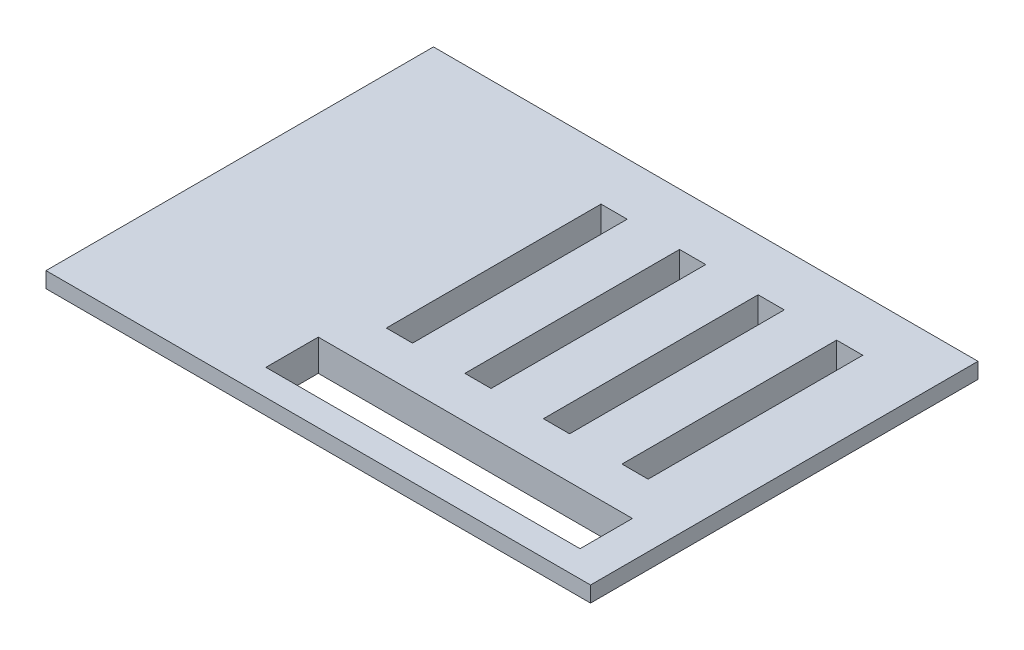
ISO-10303-21;
HEADER;
FILE_DESCRIPTION(('STEP AP214'),'2;1');
FILE_NAME('part.step','',(''),(''),'','','');
FILE_SCHEMA(('AUTOMOTIVE_DESIGN { 1 0 10303 214 1 1 1 1 }'));
ENDSEC;
DATA;
#1=APPLICATION_CONTEXT('core data for automotive mechanical design processes');
#2=APPLICATION_PROTOCOL_DEFINITION('international standard','automotive_design',2000,#1);
#3=PRODUCT_CONTEXT('',#1,'mechanical');
#4=PRODUCT('Part','Part','',(#3));
#5=PRODUCT_RELATED_PRODUCT_CATEGORY('part','',(#4));
#6=PRODUCT_DEFINITION_FORMATION('','',#4);
#7=PRODUCT_DEFINITION_CONTEXT('part definition',#1,'design');
#8=PRODUCT_DEFINITION('design','',#6,#7);
#9=PRODUCT_DEFINITION_SHAPE('','',#8);
#10=(LENGTH_UNIT() NAMED_UNIT(*) SI_UNIT(.MILLI.,.METRE.));
#11=(NAMED_UNIT(*) PLANE_ANGLE_UNIT() SI_UNIT($,.RADIAN.));
#12=(NAMED_UNIT(*) SI_UNIT($,.STERADIAN.) SOLID_ANGLE_UNIT());
#13=UNCERTAINTY_MEASURE_WITH_UNIT(LENGTH_MEASURE(1.E-05),#10,'distance_accuracy_value','');
#14=(GEOMETRIC_REPRESENTATION_CONTEXT(3) GLOBAL_UNCERTAINTY_ASSIGNED_CONTEXT((#13)) GLOBAL_UNIT_ASSIGNED_CONTEXT((#10,
#11,#12)) REPRESENTATION_CONTEXT('',''));
#15=CARTESIAN_POINT('',(0.,0.,0.));
#16=DIRECTION('',(0.,0.,1.));
#17=DIRECTION('',(1.,0.,0.));
#18=AXIS2_PLACEMENT_3D('',#15,#16,#17);
#19=CARTESIAN_POINT('',(0.,-3.,0.));
#20=DIRECTION('',(0.,1.,0.));
#21=DIRECTION('',(0.,0.,1.));
#22=AXIS2_PLACEMENT_3D('',#19,#20,#21);
#23=PLANE('',#22);
#24=DIRECTION('',(1.,0.,0.));
#25=VECTOR('',#24,1.);
#26=CARTESIAN_POINT('',(65.,-3.,-59.));
#27=LINE('',#26,#25);
#28=CARTESIAN_POINT('',(65.,-3.,-59.));
#29=VERTEX_POINT('',#28);
#30=CARTESIAN_POINT('',(70.,-3.,-59.));
#31=VERTEX_POINT('',#30);
#32=EDGE_CURVE('E279',#29,#31,#27,.T.);
#33=ORIENTED_EDGE('',*,*,#32,.F.);
#34=DIRECTION('',(0.,0.,1.));
#35=VECTOR('',#34,1.);
#36=CARTESIAN_POINT('',(65.,-3.,-59.));
#37=LINE('',#36,#35);
#38=CARTESIAN_POINT('',(65.,-3.,-18.));
#39=VERTEX_POINT('',#38);
#40=EDGE_CURVE('E274',#29,#39,#37,.T.);
#41=ORIENTED_EDGE('',*,*,#40,.T.);
#42=DIRECTION('',(1.,0.,0.));
#43=VECTOR('',#42,1.);
#44=CARTESIAN_POINT('',(65.,-3.,-18.));
#45=LINE('',#44,#43);
#46=CARTESIAN_POINT('',(70.,-3.,-18.));
#47=VERTEX_POINT('',#46);
#48=EDGE_CURVE('E61',#39,#47,#45,.T.);
#49=ORIENTED_EDGE('',*,*,#48,.T.);
#50=DIRECTION('',(0.,0.,1.));
#51=VECTOR('',#50,1.);
#52=CARTESIAN_POINT('',(70.,-3.,-59.));
#53=LINE('',#52,#51);
#54=EDGE_CURVE('E292',#31,#47,#53,.T.);
#55=ORIENTED_EDGE('',*,*,#54,.F.);
#56=EDGE_LOOP('',(#33,#41,#49,#55));
#57=FACE_BOUND('',#56,.T.);
#58=DIRECTION('',(0.,0.,1.));
#59=VECTOR('',#58,1.);
#60=CARTESIAN_POINT('',(55.,-3.,0.));
#61=LINE('',#60,#59);
#62=CARTESIAN_POINT('',(55.,-3.,-59.));
#63=VERTEX_POINT('',#62);
#64=CARTESIAN_POINT('',(55.,-3.,-18.));
#65=VERTEX_POINT('',#64);
#66=EDGE_CURVE('E310',#63,#65,#61,.T.);
#67=ORIENTED_EDGE('',*,*,#66,.F.);
#68=DIRECTION('',(1.,0.,0.));
#69=VECTOR('',#68,1.);
#70=CARTESIAN_POINT('',(0.,-3.,-59.));
#71=LINE('',#70,#69);
#72=CARTESIAN_POINT('',(50.,-3.,-59.));
#73=VERTEX_POINT('',#72);
#74=EDGE_CURVE('E323',#73,#63,#71,.T.);
#75=ORIENTED_EDGE('',*,*,#74,.F.);
#76=DIRECTION('',(0.,0.,1.));
#77=VECTOR('',#76,1.);
#78=CARTESIAN_POINT('',(50.,-3.,0.));
#79=LINE('',#78,#77);
#80=CARTESIAN_POINT('',(50.,-3.,-18.));
#81=VERTEX_POINT('',#80);
#82=EDGE_CURVE('E320',#73,#81,#79,.T.);
#83=ORIENTED_EDGE('',*,*,#82,.T.);
#84=DIRECTION('',(1.,0.,0.));
#85=VECTOR('',#84,1.);
#86=CARTESIAN_POINT('',(0.,-3.,-18.));
#87=LINE('',#86,#85);
#88=EDGE_CURVE('E298',#81,#65,#87,.T.);
#89=ORIENTED_EDGE('',*,*,#88,.T.);
#90=EDGE_LOOP('',(#67,#75,#83,#89));
#91=FACE_BOUND('',#90,.T.);
#92=DIRECTION('',(-1.,0.,0.));
#93=VECTOR('',#92,1.);
#94=CARTESIAN_POINT('',(0.,-3.,-10.));
#95=LINE('',#94,#93);
#96=CARTESIAN_POINT('',(90.,-3.,-10.));
#97=VERTEX_POINT('',#96);
#98=CARTESIAN_POINT('',(30.,-3.,-10.));
#99=VERTEX_POINT('',#98);
#100=EDGE_CURVE('E370',#97,#99,#95,.T.);
#101=ORIENTED_EDGE('',*,*,#100,.T.);
#102=DIRECTION('',(0.,0.,1.));
#103=VECTOR('',#102,1.);
#104=CARTESIAN_POINT('',(30.,-3.,0.));
#105=LINE('',#104,#103);
#106=CARTESIAN_POINT('',(30.,-3.,0.));
#107=VERTEX_POINT('',#106);
#108=EDGE_CURVE('E384',#99,#107,#105,.T.);
#109=ORIENTED_EDGE('',*,*,#108,.T.);
#110=DIRECTION('',(1.,0.,0.));
#111=VECTOR('',#110,1.);
#112=CARTESIAN_POINT('',(0.,-3.,0.));
#113=LINE('',#112,#111);
#114=CARTESIAN_POINT('',(0.,-3.,0.));
#115=VERTEX_POINT('',#114);
#116=EDGE_CURVE('E435',#115,#107,#113,.T.);
#117=ORIENTED_EDGE('',*,*,#116,.F.);
#118=DIRECTION('',(0.,0.,-1.));
#119=VECTOR('',#118,1.);
#120=CARTESIAN_POINT('',(0.,-3.,0.));
#121=LINE('',#120,#119);
#122=CARTESIAN_POINT('',(0.,-3.,-64.));
#123=VERTEX_POINT('',#122);
#124=EDGE_CURVE('E438',#115,#123,#121,.T.);
#125=ORIENTED_EDGE('',*,*,#124,.T.);
#126=DIRECTION('',(1.,0.,0.));
#127=VECTOR('',#126,1.);
#128=CARTESIAN_POINT('',(0.,-3.,-64.));
#129=LINE('',#128,#127);
#130=CARTESIAN_POINT('',(90.,-3.,-64.));
#131=VERTEX_POINT('',#130);
#132=EDGE_CURVE('E430',#123,#131,#129,.T.);
#133=ORIENTED_EDGE('',*,*,#132,.T.);
#134=DIRECTION('',(0.,0.,-1.));
#135=VECTOR('',#134,1.);
#136=CARTESIAN_POINT('',(90.,-3.,0.));
#137=LINE('',#136,#135);
#138=EDGE_CURVE('E433',#97,#131,#137,.T.);
#139=ORIENTED_EDGE('',*,*,#138,.F.);
#140=EDGE_LOOP('',(#101,#109,#117,#125,#133,#139));
#141=FACE_BOUND('',#140,.T.);
#142=DIRECTION('',(0.,0.,1.));
#143=VECTOR('',#142,1.);
#144=CARTESIAN_POINT('',(85.,-3.,1.72626141024033E-13));
#145=LINE('',#144,#143);
#146=CARTESIAN_POINT('',(85.0000000000001,-3.,-59.));
#147=VERTEX_POINT('',#146);
#148=CARTESIAN_POINT('',(85.,-3.,-18.));
#149=VERTEX_POINT('',#148);
#150=EDGE_CURVE('E339',#147,#149,#145,.T.);
#151=ORIENTED_EDGE('',*,*,#150,.F.);
#152=DIRECTION('',(1.,0.,0.));
#153=VECTOR('',#152,1.);
#154=CARTESIAN_POINT('',(0.,-3.,-59.));
#155=LINE('',#154,#153);
#156=CARTESIAN_POINT('',(80.,-3.,-59.));
#157=VERTEX_POINT('',#156);
#158=EDGE_CURVE('E352',#157,#147,#155,.T.);
#159=ORIENTED_EDGE('',*,*,#158,.F.);
#160=DIRECTION('',(0.,0.,1.));
#161=VECTOR('',#160,1.);
#162=CARTESIAN_POINT('',(80.,-3.,0.));
#163=LINE('',#162,#161);
#164=CARTESIAN_POINT('',(80.,-3.,-18.));
#165=VERTEX_POINT('',#164);
#166=EDGE_CURVE('E349',#157,#165,#163,.T.);
#167=ORIENTED_EDGE('',*,*,#166,.T.);
#168=DIRECTION('',(1.,0.,0.));
#169=VECTOR('',#168,1.);
#170=CARTESIAN_POINT('',(0.,-3.,-18.));
#171=LINE('',#170,#169);
#172=EDGE_CURVE('E329',#165,#149,#171,.T.);
#173=ORIENTED_EDGE('',*,*,#172,.T.);
#174=EDGE_LOOP('',(#151,#159,#167,#173));
#175=FACE_BOUND('',#174,.T.);
#176=DIRECTION('',(0.,0.,1.));
#177=VECTOR('',#176,1.);
#178=CARTESIAN_POINT('',(40.,-3.,0.));
#179=LINE('',#178,#177);
#180=CARTESIAN_POINT('',(40.,-3.,-59.));
#181=VERTEX_POINT('',#180);
#182=CARTESIAN_POINT('',(40.,-3.,-18.));
#183=VERTEX_POINT('',#182);
#184=EDGE_CURVE('E233',#181,#183,#179,.T.);
#185=ORIENTED_EDGE('',*,*,#184,.F.);
#186=DIRECTION('',(1.,0.,0.));
#187=VECTOR('',#186,1.);
#188=CARTESIAN_POINT('',(0.,-3.,-59.));
#189=LINE('',#188,#187);
#190=CARTESIAN_POINT('',(35.,-3.,-59.));
#191=VERTEX_POINT('',#190);
#192=EDGE_CURVE('E224',#191,#181,#189,.T.);
#193=ORIENTED_EDGE('',*,*,#192,.F.);
#194=DIRECTION('',(0.,0.,1.));
#195=VECTOR('',#194,1.);
#196=CARTESIAN_POINT('',(35.,-3.,0.));
#197=LINE('',#196,#195);
#198=CARTESIAN_POINT('',(35.,-3.,-18.));
#199=VERTEX_POINT('',#198);
#200=EDGE_CURVE('E53',#191,#199,#197,.T.);
#201=ORIENTED_EDGE('',*,*,#200,.T.);
#202=DIRECTION('',(1.,0.,0.));
#203=VECTOR('',#202,1.);
#204=CARTESIAN_POINT('',(0.,-3.,-18.));
#205=LINE('',#204,#203);
#206=EDGE_CURVE('E240',#199,#183,#205,.T.);
#207=ORIENTED_EDGE('',*,*,#206,.T.);
#208=EDGE_LOOP('',(#185,#193,#201,#207));
#209=FACE_BOUND('',#208,.T.);
#210=ADVANCED_FACE('F38',(#57,#91,#141,#175,#209),#23,.F.);
#211=CARTESIAN_POINT('',(0.,3.,0.));
#212=DIRECTION('',(0.,1.,0.));
#213=DIRECTION('',(0.,0.,1.));
#214=AXIS2_PLACEMENT_3D('',#211,#212,#213);
#215=PLANE('',#214);
#216=DIRECTION('',(0.,0.,-1.));
#217=VECTOR('',#216,1.);
#218=CARTESIAN_POINT('',(30.,3.,0.));
#219=LINE('',#218,#217);
#220=CARTESIAN_POINT('',(30.,3.,0.));
#221=VERTEX_POINT('',#220);
#222=CARTESIAN_POINT('',(30.,3.,-10.));
#223=VERTEX_POINT('',#222);
#224=EDGE_CURVE('E260',#221,#223,#219,.T.);
#225=ORIENTED_EDGE('',*,*,#224,.T.);
#226=DIRECTION('',(1.,0.,0.));
#227=VECTOR('',#226,1.);
#228=CARTESIAN_POINT('',(30.,3.,-10.));
#229=LINE('',#228,#227);
#230=CARTESIAN_POINT('',(90.,3.,-10.));
#231=VERTEX_POINT('',#230);
#232=EDGE_CURVE('E357',#223,#231,#229,.T.);
#233=ORIENTED_EDGE('',*,*,#232,.T.);
#234=DIRECTION('',(0.,0.,1.));
#235=VECTOR('',#234,1.);
#236=CARTESIAN_POINT('',(90.,3.,0.));
#237=LINE('',#236,#235);
#238=CARTESIAN_POINT('',(90.,3.,0.));
#239=VERTEX_POINT('',#238);
#240=EDGE_CURVE('E360',#231,#239,#237,.T.);
#241=ORIENTED_EDGE('',*,*,#240,.T.);
#242=DIRECTION('',(-1.,0.,0.));
#243=VECTOR('',#242,1.);
#244=CARTESIAN_POINT('',(30.,3.,0.));
#245=LINE('',#244,#243);
#246=EDGE_CURVE('E363',#239,#221,#245,.T.);
#247=ORIENTED_EDGE('',*,*,#246,.T.);
#248=EDGE_LOOP('',(#225,#233,#241,#247));
#249=FACE_BOUND('',#248,.T.);
#250=DIRECTION('',(0.,0.,1.));
#251=VECTOR('',#250,1.);
#252=CARTESIAN_POINT('',(-7.00000000000001,3.,5.00000000000001));
#253=LINE('',#252,#251);
#254=CARTESIAN_POINT('',(-7.,3.,-69.));
#255=VERTEX_POINT('',#254);
#256=CARTESIAN_POINT('',(-7.00000000000001,3.,5.00000000000001));
#257=VERTEX_POINT('',#256);
#258=EDGE_CURVE('E387',#255,#257,#253,.T.);
#259=ORIENTED_EDGE('',*,*,#258,.T.);
#260=DIRECTION('',(1.,0.,0.));
#261=VECTOR('',#260,1.);
#262=CARTESIAN_POINT('',(97.,3.,5.));
#263=LINE('',#262,#261);
#264=CARTESIAN_POINT('',(97.,3.,5.));
#265=VERTEX_POINT('',#264);
#266=EDGE_CURVE('E396',#257,#265,#263,.T.);
#267=ORIENTED_EDGE('',*,*,#266,.T.);
#268=DIRECTION('',(0.,0.,-1.));
#269=VECTOR('',#268,1.);
#270=CARTESIAN_POINT('',(97.,3.,-69.));
#271=LINE('',#270,#269);
#272=CARTESIAN_POINT('',(97.,3.,-69.));
#273=VERTEX_POINT('',#272);
#274=EDGE_CURVE('E393',#265,#273,#271,.T.);
#275=ORIENTED_EDGE('',*,*,#274,.T.);
#276=DIRECTION('',(-1.,0.,0.));
#277=VECTOR('',#276,1.);
#278=CARTESIAN_POINT('',(-7.,3.,-69.));
#279=LINE('',#278,#277);
#280=EDGE_CURVE('E390',#273,#255,#279,.T.);
#281=ORIENTED_EDGE('',*,*,#280,.T.);
#282=EDGE_LOOP('',(#259,#267,#275,#281));
#283=FACE_BOUND('',#282,.T.);
#284=DIRECTION('',(1.,0.,0.));
#285=VECTOR('',#284,1.);
#286=CARTESIAN_POINT('',(0.,3.,-59.));
#287=LINE('',#286,#285);
#288=CARTESIAN_POINT('',(50.,3.,-59.));
#289=VERTEX_POINT('',#288);
#290=CARTESIAN_POINT('',(55.,3.,-59.));
#291=VERTEX_POINT('',#290);
#292=EDGE_CURVE('E313',#289,#291,#287,.T.);
#293=ORIENTED_EDGE('',*,*,#292,.T.);
#294=DIRECTION('',(0.,0.,1.));
#295=VECTOR('',#294,1.);
#296=CARTESIAN_POINT('',(55.,3.,0.));
#297=LINE('',#296,#295);
#298=CARTESIAN_POINT('',(55.,3.,-18.));
#299=VERTEX_POINT('',#298);
#300=EDGE_CURVE('E254',#291,#299,#297,.T.);
#301=ORIENTED_EDGE('',*,*,#300,.T.);
#302=DIRECTION('',(1.,0.,0.));
#303=VECTOR('',#302,1.);
#304=CARTESIAN_POINT('',(0.,3.,-18.));
#305=LINE('',#304,#303);
#306=CARTESIAN_POINT('',(50.,3.,-18.));
#307=VERTEX_POINT('',#306);
#308=EDGE_CURVE('E306',#307,#299,#305,.T.);
#309=ORIENTED_EDGE('',*,*,#308,.F.);
#310=DIRECTION('',(0.,0.,1.));
#311=VECTOR('',#310,1.);
#312=CARTESIAN_POINT('',(50.,3.,0.));
#313=LINE('',#312,#311);
#314=EDGE_CURVE('E309',#289,#307,#313,.T.);
#315=ORIENTED_EDGE('',*,*,#314,.F.);
#316=EDGE_LOOP('',(#293,#301,#309,#315));
#317=FACE_BOUND('',#316,.T.);
#318=DIRECTION('',(1.,0.,0.));
#319=VECTOR('',#318,1.);
#320=CARTESIAN_POINT('',(0.,3.,-59.));
#321=LINE('',#320,#319);
#322=CARTESIAN_POINT('',(80.,3.,-59.));
#323=VERTEX_POINT('',#322);
#324=CARTESIAN_POINT('',(85.0000000000001,3.,-59.));
#325=VERTEX_POINT('',#324);
#326=EDGE_CURVE('E342',#323,#325,#321,.T.);
#327=ORIENTED_EDGE('',*,*,#326,.T.);
#328=DIRECTION('',(0.,0.,1.));
#329=VECTOR('',#328,1.);
#330=CARTESIAN_POINT('',(85.,3.,1.72626141024033E-13));
#331=LINE('',#330,#329);
#332=CARTESIAN_POINT('',(85.,3.,-18.));
#333=VERTEX_POINT('',#332);
#334=EDGE_CURVE('E305',#325,#333,#331,.T.);
#335=ORIENTED_EDGE('',*,*,#334,.T.);
#336=DIRECTION('',(1.,0.,0.));
#337=VECTOR('',#336,1.);
#338=CARTESIAN_POINT('',(0.,3.,-18.));
#339=LINE('',#338,#337);
#340=CARTESIAN_POINT('',(80.,3.,-18.));
#341=VERTEX_POINT('',#340);
#342=EDGE_CURVE('E335',#341,#333,#339,.T.);
#343=ORIENTED_EDGE('',*,*,#342,.F.);
#344=DIRECTION('',(0.,0.,1.));
#345=VECTOR('',#344,1.);
#346=CARTESIAN_POINT('',(80.,3.,0.));
#347=LINE('',#346,#345);
#348=EDGE_CURVE('E338',#323,#341,#347,.T.);
#349=ORIENTED_EDGE('',*,*,#348,.F.);
#350=EDGE_LOOP('',(#327,#335,#343,#349));
#351=FACE_BOUND('',#350,.T.);
#352=DIRECTION('',(0.,0.,1.));
#353=VECTOR('',#352,1.);
#354=CARTESIAN_POINT('',(65.,3.,-59.));
#355=LINE('',#354,#353);
#356=CARTESIAN_POINT('',(65.,3.,-59.));
#357=VERTEX_POINT('',#356);
#358=CARTESIAN_POINT('',(65.,3.,-18.));
#359=VERTEX_POINT('',#358);
#360=EDGE_CURVE('E275',#357,#359,#355,.T.);
#361=ORIENTED_EDGE('',*,*,#360,.F.);
#362=DIRECTION('',(1.,0.,0.));
#363=VECTOR('',#362,1.);
#364=CARTESIAN_POINT('',(65.,3.,-59.));
#365=LINE('',#364,#363);
#366=CARTESIAN_POINT('',(70.,3.,-59.));
#367=VERTEX_POINT('',#366);
#368=EDGE_CURVE('E285',#357,#367,#365,.T.);
#369=ORIENTED_EDGE('',*,*,#368,.T.);
#370=DIRECTION('',(0.,0.,1.));
#371=VECTOR('',#370,1.);
#372=CARTESIAN_POINT('',(70.,3.,-59.));
#373=LINE('',#372,#371);
#374=CARTESIAN_POINT('',(70.,3.,-18.));
#375=VERTEX_POINT('',#374);
#376=EDGE_CURVE('E282',#367,#375,#373,.T.);
#377=ORIENTED_EDGE('',*,*,#376,.T.);
#378=DIRECTION('',(1.,0.,0.));
#379=VECTOR('',#378,1.);
#380=CARTESIAN_POINT('',(65.,3.,-18.));
#381=LINE('',#380,#379);
#382=EDGE_CURVE('E278',#359,#375,#381,.T.);
#383=ORIENTED_EDGE('',*,*,#382,.F.);
#384=EDGE_LOOP('',(#361,#369,#377,#383));
#385=FACE_BOUND('',#384,.T.);
#386=DIRECTION('',(1.,0.,0.));
#387=VECTOR('',#386,1.);
#388=CARTESIAN_POINT('',(0.,3.,-59.));
#389=LINE('',#388,#387);
#390=CARTESIAN_POINT('',(35.,3.,-59.));
#391=VERTEX_POINT('',#390);
#392=CARTESIAN_POINT('',(40.,3.,-59.));
#393=VERTEX_POINT('',#392);
#394=EDGE_CURVE('E253',#391,#393,#389,.T.);
#395=ORIENTED_EDGE('',*,*,#394,.T.);
#396=DIRECTION('',(0.,0.,1.));
#397=VECTOR('',#396,1.);
#398=CARTESIAN_POINT('',(40.,3.,0.));
#399=LINE('',#398,#397);
#400=CARTESIAN_POINT('',(40.,3.,-18.));
#401=VERTEX_POINT('',#400);
#402=EDGE_CURVE('E239',#393,#401,#399,.T.);
#403=ORIENTED_EDGE('',*,*,#402,.T.);
#404=DIRECTION('',(1.,0.,0.));
#405=VECTOR('',#404,1.);
#406=CARTESIAN_POINT('',(0.,3.,-18.));
#407=LINE('',#406,#405);
#408=CARTESIAN_POINT('',(35.,3.,-18.));
#409=VERTEX_POINT('',#408);
#410=EDGE_CURVE('E244',#409,#401,#407,.T.);
#411=ORIENTED_EDGE('',*,*,#410,.F.);
#412=DIRECTION('',(0.,0.,1.));
#413=VECTOR('',#412,1.);
#414=CARTESIAN_POINT('',(35.,3.,0.));
#415=LINE('',#414,#413);
#416=EDGE_CURVE('E247',#391,#409,#415,.T.);
#417=ORIENTED_EDGE('',*,*,#416,.F.);
#418=EDGE_LOOP('',(#395,#403,#411,#417));
#419=FACE_BOUND('',#418,.T.);
#420=ADVANCED_FACE('F476',(#249,#283,#317,#351,#385,#419),#215,.T.);
#421=CARTESIAN_POINT('',(0.,-3.,-64.));
#422=DIRECTION('',(0.,0.,1.));
#423=DIRECTION('',(1.,0.,0.));
#424=AXIS2_PLACEMENT_3D('',#421,#422,#423);
#425=PLANE('',#424);
#426=DIRECTION('',(0.,1.,0.));
#427=VECTOR('',#426,1.);
#428=CARTESIAN_POINT('',(0.,-3.,-64.));
#429=LINE('',#428,#427);
#430=CARTESIAN_POINT('',(0.,0.,-64.));
#431=VERTEX_POINT('',#430);
#432=EDGE_CURVE('E440',#123,#431,#429,.T.);
#433=ORIENTED_EDGE('',*,*,#432,.T.);
#434=DIRECTION('',(-1.,0.,0.));
#435=VECTOR('',#434,1.);
#436=CARTESIAN_POINT('',(0.,0.,-64.));
#437=LINE('',#436,#435);
#438=CARTESIAN_POINT('',(90.,0.,-64.));
#439=VERTEX_POINT('',#438);
#440=EDGE_CURVE('E408',#439,#431,#437,.T.);
#441=ORIENTED_EDGE('',*,*,#440,.F.);
#442=DIRECTION('',(0.,1.,0.));
#443=VECTOR('',#442,1.);
#444=CARTESIAN_POINT('',(90.,-3.,-64.));
#445=LINE('',#444,#443);
#446=EDGE_CURVE('E11',#131,#439,#445,.T.);
#447=ORIENTED_EDGE('',*,*,#446,.F.);
#448=ORIENTED_EDGE('',*,*,#132,.F.);
#449=EDGE_LOOP('',(#433,#441,#447,#448));
#450=FACE_BOUND('',#449,.T.);
#451=ADVANCED_FACE('F40',(#450),#425,.F.);
#452=CARTESIAN_POINT('',(90.,-3.,0.));
#453=DIRECTION('',(1.,0.,0.));
#454=DIRECTION('',(0.,0.,-1.));
#455=AXIS2_PLACEMENT_3D('',#452,#453,#454);
#456=PLANE('',#455);
#457=DIRECTION('',(0.,-1.,0.));
#458=VECTOR('',#457,1.);
#459=CARTESIAN_POINT('',(90.,3.,-10.));
#460=LINE('',#459,#458);
#461=CARTESIAN_POINT('',(90.,0.,-10.));
#462=VERTEX_POINT('',#461);
#463=EDGE_CURVE('E377',#462,#97,#460,.T.);
#464=ORIENTED_EDGE('',*,*,#463,.T.);
#465=ORIENTED_EDGE('',*,*,#138,.T.);
#466=ORIENTED_EDGE('',*,*,#446,.T.);
#467=DIRECTION('',(0.,0.,-1.));
#468=VECTOR('',#467,1.);
#469=CARTESIAN_POINT('',(90.,0.,0.));
#470=LINE('',#469,#468);
#471=EDGE_CURVE('E404',#462,#439,#470,.T.);
#472=ORIENTED_EDGE('',*,*,#471,.F.);
#473=EDGE_LOOP('',(#464,#465,#466,#472));
#474=FACE_BOUND('',#473,.T.);
#475=ADVANCED_FACE('F463',(#474),#456,.T.);
#476=CARTESIAN_POINT('',(0.,-3.,0.));
#477=DIRECTION('',(0.,0.,1.));
#478=DIRECTION('',(1.,0.,0.));
#479=AXIS2_PLACEMENT_3D('',#476,#477,#478);
#480=PLANE('',#479);
#481=DIRECTION('',(0.,-1.,0.));
#482=VECTOR('',#481,1.);
#483=CARTESIAN_POINT('',(30.,3.,0.));
#484=LINE('',#483,#482);
#485=CARTESIAN_POINT('',(30.,0.,0.));
#486=VERTEX_POINT('',#485);
#487=EDGE_CURVE('E371',#486,#107,#484,.T.);
#488=ORIENTED_EDGE('',*,*,#487,.F.);
#489=DIRECTION('',(1.,0.,0.));
#490=VECTOR('',#489,1.);
#491=CARTESIAN_POINT('',(0.,0.,0.));
#492=LINE('',#491,#490);
#493=CARTESIAN_POINT('',(0.,0.,0.));
#494=VERTEX_POINT('',#493);
#495=EDGE_CURVE('E401',#494,#486,#492,.T.);
#496=ORIENTED_EDGE('',*,*,#495,.F.);
#497=DIRECTION('',(0.,1.,0.));
#498=VECTOR('',#497,1.);
#499=CARTESIAN_POINT('',(0.,-3.,0.));
#500=LINE('',#499,#498);
#501=EDGE_CURVE('E46',#115,#494,#500,.T.);
#502=ORIENTED_EDGE('',*,*,#501,.F.);
#503=ORIENTED_EDGE('',*,*,#116,.T.);
#504=EDGE_LOOP('',(#488,#496,#502,#503));
#505=FACE_BOUND('',#504,.T.);
#506=ADVANCED_FACE('F452',(#505),#480,.T.);
#507=CARTESIAN_POINT('',(0.,-3.,0.));
#508=DIRECTION('',(1.,0.,0.));
#509=DIRECTION('',(0.,0.,-1.));
#510=AXIS2_PLACEMENT_3D('',#507,#508,#509);
#511=PLANE('',#510);
#512=ORIENTED_EDGE('',*,*,#501,.T.);
#513=DIRECTION('',(0.,0.,1.));
#514=VECTOR('',#513,1.);
#515=CARTESIAN_POINT('',(0.,0.,0.));
#516=LINE('',#515,#514);
#517=EDGE_CURVE('E399',#431,#494,#516,.T.);
#518=ORIENTED_EDGE('',*,*,#517,.F.);
#519=ORIENTED_EDGE('',*,*,#432,.F.);
#520=ORIENTED_EDGE('',*,*,#124,.F.);
#521=EDGE_LOOP('',(#512,#518,#519,#520));
#522=FACE_BOUND('',#521,.T.);
#523=ADVANCED_FACE('F446',(#522),#511,.F.);
#524=CARTESIAN_POINT('',(-7.00000000000001,130.640119084871,5.00000000000001));
#525=DIRECTION('',(1.,0.,0.));
#526=DIRECTION('',(0.,0.,-1.));
#527=AXIS2_PLACEMENT_3D('',#524,#525,#526);
#528=PLANE('',#527);
#529=ORIENTED_EDGE('',*,*,#258,.F.);
#530=DIRECTION('',(0.,-1.,0.));
#531=VECTOR('',#530,1.);
#532=CARTESIAN_POINT('',(-7.,130.640119084871,-69.));
#533=LINE('',#532,#531);
#534=CARTESIAN_POINT('',(-7.,0.,-69.));
#535=VERTEX_POINT('',#534);
#536=EDGE_CURVE('E424',#255,#535,#533,.T.);
#537=ORIENTED_EDGE('',*,*,#536,.T.);
#538=DIRECTION('',(0.,0.,1.));
#539=VECTOR('',#538,1.);
#540=CARTESIAN_POINT('',(-7.00000000000001,0.,5.00000000000001));
#541=LINE('',#540,#539);
#542=CARTESIAN_POINT('',(-7.00000000000001,0.,5.00000000000001));
#543=VERTEX_POINT('',#542);
#544=EDGE_CURVE('E419',#535,#543,#541,.T.);
#545=ORIENTED_EDGE('',*,*,#544,.T.);
#546=DIRECTION('',(0.,-1.,0.));
#547=VECTOR('',#546,1.);
#548=CARTESIAN_POINT('',(-7.00000000000001,130.640119084871,5.00000000000001));
#549=LINE('',#548,#547);
#550=EDGE_CURVE('E422',#257,#543,#549,.T.);
#551=ORIENTED_EDGE('',*,*,#550,.F.);
#552=EDGE_LOOP('',(#529,#537,#545,#551));
#553=FACE_BOUND('',#552,.T.);
#554=ADVANCED_FACE('F508',(#553),#528,.F.);
#555=CARTESIAN_POINT('',(-7.,130.640119084871,-69.));
#556=DIRECTION('',(0.,0.,1.));
#557=DIRECTION('',(1.,0.,0.));
#558=AXIS2_PLACEMENT_3D('',#555,#556,#557);
#559=PLANE('',#558);
#560=ORIENTED_EDGE('',*,*,#280,.F.);
#561=DIRECTION('',(0.,-1.,0.));
#562=VECTOR('',#561,1.);
#563=CARTESIAN_POINT('',(97.,130.640119084871,-69.));
#564=LINE('',#563,#562);
#565=CARTESIAN_POINT('',(97.,0.,-69.));
#566=VERTEX_POINT('',#565);
#567=EDGE_CURVE('E426',#273,#566,#564,.T.);
#568=ORIENTED_EDGE('',*,*,#567,.T.);
#569=DIRECTION('',(-1.,0.,0.));
#570=VECTOR('',#569,1.);
#571=CARTESIAN_POINT('',(-7.,0.,-69.));
#572=LINE('',#571,#570);
#573=EDGE_CURVE('E416',#566,#535,#572,.T.);
#574=ORIENTED_EDGE('',*,*,#573,.T.);
#575=ORIENTED_EDGE('',*,*,#536,.F.);
#576=EDGE_LOOP('',(#560,#568,#574,#575));
#577=FACE_BOUND('',#576,.T.);
#578=ADVANCED_FACE('F777',(#577),#559,.F.);
#579=CARTESIAN_POINT('',(97.,130.640119084871,-69.));
#580=DIRECTION('',(-1.,0.,0.));
#581=DIRECTION('',(0.,0.,1.));
#582=AXIS2_PLACEMENT_3D('',#579,#580,#581);
#583=PLANE('',#582);
#584=ORIENTED_EDGE('',*,*,#274,.F.);
#585=DIRECTION('',(0.,-1.,0.));
#586=VECTOR('',#585,1.);
#587=CARTESIAN_POINT('',(97.,130.640119084871,5.));
#588=LINE('',#587,#586);
#589=CARTESIAN_POINT('',(97.,0.,5.));
#590=VERTEX_POINT('',#589);
#591=EDGE_CURVE('E428',#265,#590,#588,.T.);
#592=ORIENTED_EDGE('',*,*,#591,.T.);
#593=DIRECTION('',(0.,0.,-1.));
#594=VECTOR('',#593,1.);
#595=CARTESIAN_POINT('',(97.,0.,-69.));
#596=LINE('',#595,#594);
#597=EDGE_CURVE('E413',#590,#566,#596,.T.);
#598=ORIENTED_EDGE('',*,*,#597,.T.);
#599=ORIENTED_EDGE('',*,*,#567,.F.);
#600=EDGE_LOOP('',(#584,#592,#598,#599));
#601=FACE_BOUND('',#600,.T.);
#602=ADVANCED_FACE('F768',(#601),#583,.F.);
#603=CARTESIAN_POINT('',(97.,130.640119084871,5.));
#604=DIRECTION('',(0.,0.,-1.));
#605=DIRECTION('',(-1.,0.,0.));
#606=AXIS2_PLACEMENT_3D('',#603,#604,#605);
#607=PLANE('',#606);
#608=ORIENTED_EDGE('',*,*,#266,.F.);
#609=ORIENTED_EDGE('',*,*,#550,.T.);
#610=DIRECTION('',(1.,0.,0.));
#611=VECTOR('',#610,1.);
#612=CARTESIAN_POINT('',(97.,0.,5.));
#613=LINE('',#612,#611);
#614=EDGE_CURVE('E410',#543,#590,#613,.T.);
#615=ORIENTED_EDGE('',*,*,#614,.T.);
#616=ORIENTED_EDGE('',*,*,#591,.F.);
#617=EDGE_LOOP('',(#608,#609,#615,#616));
#618=FACE_BOUND('',#617,.T.);
#619=ADVANCED_FACE('F747',(#618),#607,.F.);
#620=CARTESIAN_POINT('',(0.,0.,0.));
#621=DIRECTION('',(0.,-1.,0.));
#622=DIRECTION('',(0.,0.,-1.));
#623=AXIS2_PLACEMENT_3D('',#620,#621,#622);
#624=PLANE('',#623);
#625=ORIENTED_EDGE('',*,*,#614,.F.);
#626=ORIENTED_EDGE('',*,*,#544,.F.);
#627=ORIENTED_EDGE('',*,*,#573,.F.);
#628=ORIENTED_EDGE('',*,*,#597,.F.);
#629=EDGE_LOOP('',(#625,#626,#627,#628));
#630=FACE_BOUND('',#629,.T.);
#631=ORIENTED_EDGE('',*,*,#440,.T.);
#632=ORIENTED_EDGE('',*,*,#517,.T.);
#633=ORIENTED_EDGE('',*,*,#495,.T.);
#634=DIRECTION('',(-1.,0.,0.));
#635=VECTOR('',#634,1.);
#636=CARTESIAN_POINT('',(0.,0.,0.));
#637=LINE('',#636,#635);
#638=CARTESIAN_POINT('',(90.,0.,0.));
#639=VERTEX_POINT('',#638);
#640=EDGE_CURVE('E382',#639,#486,#637,.T.);
#641=ORIENTED_EDGE('',*,*,#640,.F.);
#642=EDGE_CURVE('E405',#639,#462,#470,.T.);
#643=ORIENTED_EDGE('',*,*,#642,.T.);
#644=ORIENTED_EDGE('',*,*,#471,.T.);
#645=EDGE_LOOP('',(#631,#632,#633,#641,#643,#644));
#646=FACE_BOUND('',#645,.T.);
#647=ADVANCED_FACE('F455',(#630,#646),#624,.T.);
#648=CARTESIAN_POINT('',(30.,3.,0.));
#649=DIRECTION('',(-1.,0.,0.));
#650=DIRECTION('',(0.,0.,1.));
#651=AXIS2_PLACEMENT_3D('',#648,#649,#650);
#652=PLANE('',#651);
#653=DIRECTION('',(0.,-1.,0.));
#654=VECTOR('',#653,1.);
#655=CARTESIAN_POINT('',(30.,3.,-10.));
#656=LINE('',#655,#654);
#657=EDGE_CURVE('E366',#223,#99,#656,.T.);
#658=ORIENTED_EDGE('',*,*,#657,.F.);
#659=ORIENTED_EDGE('',*,*,#224,.F.);
#660=EDGE_CURVE('E367',#221,#486,#484,.T.);
#661=ORIENTED_EDGE('',*,*,#660,.T.);
#662=ORIENTED_EDGE('',*,*,#487,.T.);
#663=ORIENTED_EDGE('',*,*,#108,.F.);
#664=EDGE_LOOP('',(#658,#659,#661,#662,#663));
#665=FACE_BOUND('',#664,.T.);
#666=ADVANCED_FACE('F469',(#665),#652,.F.);
#667=CARTESIAN_POINT('',(30.,3.,-10.));
#668=DIRECTION('',(0.,0.,-1.));
#669=DIRECTION('',(-1.,0.,0.));
#670=AXIS2_PLACEMENT_3D('',#667,#668,#669);
#671=PLANE('',#670);
#672=ORIENTED_EDGE('',*,*,#463,.F.);
#673=EDGE_CURVE('E375',#231,#462,#460,.T.);
#674=ORIENTED_EDGE('',*,*,#673,.F.);
#675=ORIENTED_EDGE('',*,*,#232,.F.);
#676=ORIENTED_EDGE('',*,*,#657,.T.);
#677=ORIENTED_EDGE('',*,*,#100,.F.);
#678=EDGE_LOOP('',(#672,#674,#675,#676,#677));
#679=FACE_BOUND('',#678,.T.);
#680=ADVANCED_FACE('F473',(#679),#671,.F.);
#681=CARTESIAN_POINT('',(30.,3.,0.));
#682=DIRECTION('',(0.,0.,1.));
#683=DIRECTION('',(1.,0.,0.));
#684=AXIS2_PLACEMENT_3D('',#681,#682,#683);
#685=PLANE('',#684);
#686=ORIENTED_EDGE('',*,*,#640,.T.);
#687=ORIENTED_EDGE('',*,*,#660,.F.);
#688=ORIENTED_EDGE('',*,*,#246,.F.);
#689=DIRECTION('',(0.,-1.,0.));
#690=VECTOR('',#689,1.);
#691=CARTESIAN_POINT('',(90.,3.,0.));
#692=LINE('',#691,#690);
#693=EDGE_CURVE('E372',#239,#639,#692,.T.);
#694=ORIENTED_EDGE('',*,*,#693,.T.);
#695=EDGE_LOOP('',(#686,#687,#688,#694));
#696=FACE_BOUND('',#695,.T.);
#697=ADVANCED_FACE('F480',(#696),#685,.F.);
#698=CARTESIAN_POINT('',(90.,3.,0.));
#699=DIRECTION('',(1.,0.,0.));
#700=DIRECTION('',(0.,0.,-1.));
#701=AXIS2_PLACEMENT_3D('',#698,#699,#700);
#702=PLANE('',#701);
#703=ORIENTED_EDGE('',*,*,#642,.F.);
#704=ORIENTED_EDGE('',*,*,#693,.F.);
#705=ORIENTED_EDGE('',*,*,#240,.F.);
#706=ORIENTED_EDGE('',*,*,#673,.T.);
#707=EDGE_LOOP('',(#703,#704,#705,#706));
#708=FACE_BOUND('',#707,.T.);
#709=ADVANCED_FACE('F482',(#708),#702,.F.);
#710=CARTESIAN_POINT('',(55.,-3.,0.));
#711=DIRECTION('',(-1.,0.,0.));
#712=DIRECTION('',(0.,0.,1.));
#713=AXIS2_PLACEMENT_3D('',#710,#711,#712);
#714=PLANE('',#713);
#715=ORIENTED_EDGE('',*,*,#300,.F.);
#716=DIRECTION('',(0.,1.,0.));
#717=VECTOR('',#716,1.);
#718=CARTESIAN_POINT('',(55.,-3.,-59.));
#719=LINE('',#718,#717);
#720=EDGE_CURVE('E295',#63,#291,#719,.T.);
#721=ORIENTED_EDGE('',*,*,#720,.F.);
#722=ORIENTED_EDGE('',*,*,#66,.T.);
#723=DIRECTION('',(0.,1.,0.));
#724=VECTOR('',#723,1.);
#725=CARTESIAN_POINT('',(55.,-3.,-18.));
#726=LINE('',#725,#724);
#727=EDGE_CURVE('E303',#65,#299,#726,.T.);
#728=ORIENTED_EDGE('',*,*,#727,.T.);
#729=EDGE_LOOP('',(#715,#721,#722,#728));
#730=FACE_BOUND('',#729,.T.);
#731=ADVANCED_FACE('F484',(#730),#714,.T.);
#732=CARTESIAN_POINT('',(0.,-3.,-18.));
#733=DIRECTION('',(0.,0.,1.));
#734=DIRECTION('',(1.,0.,0.));
#735=AXIS2_PLACEMENT_3D('',#732,#733,#734);
#736=PLANE('',#735);
#737=ORIENTED_EDGE('',*,*,#308,.T.);
#738=ORIENTED_EDGE('',*,*,#727,.F.);
#739=ORIENTED_EDGE('',*,*,#88,.F.);
#740=DIRECTION('',(0.,1.,0.));
#741=VECTOR('',#740,1.);
#742=CARTESIAN_POINT('',(50.,-3.,-18.));
#743=LINE('',#742,#741);
#744=EDGE_CURVE('E301',#81,#307,#743,.T.);
#745=ORIENTED_EDGE('',*,*,#744,.T.);
#746=EDGE_LOOP('',(#737,#738,#739,#745));
#747=FACE_BOUND('',#746,.T.);
#748=ADVANCED_FACE('F490',(#747),#736,.F.);
#749=CARTESIAN_POINT('',(50.,-3.,0.));
#750=DIRECTION('',(-1.,0.,0.));
#751=DIRECTION('',(0.,0.,1.));
#752=AXIS2_PLACEMENT_3D('',#749,#750,#751);
#753=PLANE('',#752);
#754=ORIENTED_EDGE('',*,*,#314,.T.);
#755=ORIENTED_EDGE('',*,*,#744,.F.);
#756=ORIENTED_EDGE('',*,*,#82,.F.);
#757=DIRECTION('',(0.,1.,0.));
#758=VECTOR('',#757,1.);
#759=CARTESIAN_POINT('',(50.,-3.,-59.));
#760=LINE('',#759,#758);
#761=EDGE_CURVE('E299',#73,#289,#760,.T.);
#762=ORIENTED_EDGE('',*,*,#761,.T.);
#763=EDGE_LOOP('',(#754,#755,#756,#762));
#764=FACE_BOUND('',#763,.T.);
#765=ADVANCED_FACE('F540',(#764),#753,.F.);
#766=CARTESIAN_POINT('',(0.,-3.,-59.));
#767=DIRECTION('',(0.,0.,1.));
#768=DIRECTION('',(1.,0.,0.));
#769=AXIS2_PLACEMENT_3D('',#766,#767,#768);
#770=PLANE('',#769);
#771=ORIENTED_EDGE('',*,*,#292,.F.);
#772=ORIENTED_EDGE('',*,*,#761,.F.);
#773=ORIENTED_EDGE('',*,*,#74,.T.);
#774=ORIENTED_EDGE('',*,*,#720,.T.);
#775=EDGE_LOOP('',(#771,#772,#773,#774));
#776=FACE_BOUND('',#775,.T.);
#777=ADVANCED_FACE('F550',(#776),#770,.T.);
#778=CARTESIAN_POINT('',(85.,-3.,1.72626141024033E-13));
#779=DIRECTION('',(-1.,0.,0.));
#780=DIRECTION('',(0.,0.,1.));
#781=AXIS2_PLACEMENT_3D('',#778,#779,#780);
#782=PLANE('',#781);
#783=ORIENTED_EDGE('',*,*,#334,.F.);
#784=DIRECTION('',(0.,1.,0.));
#785=VECTOR('',#784,1.);
#786=CARTESIAN_POINT('',(85.0000000000001,-3.,-59.));
#787=LINE('',#786,#785);
#788=EDGE_CURVE('E326',#147,#325,#787,.T.);
#789=ORIENTED_EDGE('',*,*,#788,.F.);
#790=ORIENTED_EDGE('',*,*,#150,.T.);
#791=DIRECTION('',(0.,1.,0.));
#792=VECTOR('',#791,1.);
#793=CARTESIAN_POINT('',(85.,-3.,-18.));
#794=LINE('',#793,#792);
#795=EDGE_CURVE('E288',#149,#333,#794,.T.);
#796=ORIENTED_EDGE('',*,*,#795,.T.);
#797=EDGE_LOOP('',(#783,#789,#790,#796));
#798=FACE_BOUND('',#797,.T.);
#799=ADVANCED_FACE('F560',(#798),#782,.T.);
#800=CARTESIAN_POINT('',(0.,-3.,-18.));
#801=DIRECTION('',(0.,0.,1.));
#802=DIRECTION('',(1.,0.,0.));
#803=AXIS2_PLACEMENT_3D('',#800,#801,#802);
#804=PLANE('',#803);
#805=ORIENTED_EDGE('',*,*,#342,.T.);
#806=ORIENTED_EDGE('',*,*,#795,.F.);
#807=ORIENTED_EDGE('',*,*,#172,.F.);
#808=DIRECTION('',(0.,1.,0.));
#809=VECTOR('',#808,1.);
#810=CARTESIAN_POINT('',(80.,-3.,-18.));
#811=LINE('',#810,#809);
#812=EDGE_CURVE('E332',#165,#341,#811,.T.);
#813=ORIENTED_EDGE('',*,*,#812,.T.);
#814=EDGE_LOOP('',(#805,#806,#807,#813));
#815=FACE_BOUND('',#814,.T.);
#816=ADVANCED_FACE('F570',(#815),#804,.F.);
#817=CARTESIAN_POINT('',(80.,-3.,0.));
#818=DIRECTION('',(-1.,0.,0.));
#819=DIRECTION('',(0.,0.,1.));
#820=AXIS2_PLACEMENT_3D('',#817,#818,#819);
#821=PLANE('',#820);
#822=ORIENTED_EDGE('',*,*,#348,.T.);
#823=ORIENTED_EDGE('',*,*,#812,.F.);
#824=ORIENTED_EDGE('',*,*,#166,.F.);
#825=DIRECTION('',(0.,1.,0.));
#826=VECTOR('',#825,1.);
#827=CARTESIAN_POINT('',(80.,-3.,-59.));
#828=LINE('',#827,#826);
#829=EDGE_CURVE('E330',#157,#323,#828,.T.);
#830=ORIENTED_EDGE('',*,*,#829,.T.);
#831=EDGE_LOOP('',(#822,#823,#824,#830));
#832=FACE_BOUND('',#831,.T.);
#833=ADVANCED_FACE('F581',(#832),#821,.F.);
#834=CARTESIAN_POINT('',(0.,-3.,-59.));
#835=DIRECTION('',(0.,0.,1.));
#836=DIRECTION('',(1.,0.,0.));
#837=AXIS2_PLACEMENT_3D('',#834,#835,#836);
#838=PLANE('',#837);
#839=ORIENTED_EDGE('',*,*,#326,.F.);
#840=ORIENTED_EDGE('',*,*,#829,.F.);
#841=ORIENTED_EDGE('',*,*,#158,.T.);
#842=ORIENTED_EDGE('',*,*,#788,.T.);
#843=EDGE_LOOP('',(#839,#840,#841,#842));
#844=FACE_BOUND('',#843,.T.);
#845=ADVANCED_FACE('F591',(#844),#838,.T.);
#846=CARTESIAN_POINT('',(65.,-3.,-59.));
#847=DIRECTION('',(0.,0.,1.));
#848=DIRECTION('',(1.,0.,0.));
#849=AXIS2_PLACEMENT_3D('',#846,#847,#848);
#850=PLANE('',#849);
#851=ORIENTED_EDGE('',*,*,#368,.F.);
#852=DIRECTION('',(0.,1.,0.));
#853=VECTOR('',#852,1.);
#854=CARTESIAN_POINT('',(65.,-3.,-59.));
#855=LINE('',#854,#853);
#856=EDGE_CURVE('E271',#29,#357,#855,.T.);
#857=ORIENTED_EDGE('',*,*,#856,.F.);
#858=ORIENTED_EDGE('',*,*,#32,.T.);
#859=DIRECTION('',(0.,1.,0.));
#860=VECTOR('',#859,1.);
#861=CARTESIAN_POINT('',(70.,-3.,-59.));
#862=LINE('',#861,#860);
#863=EDGE_CURVE('E264',#31,#367,#862,.T.);
#864=ORIENTED_EDGE('',*,*,#863,.T.);
#865=EDGE_LOOP('',(#851,#857,#858,#864));
#866=FACE_BOUND('',#865,.T.);
#867=ADVANCED_FACE('F601',(#866),#850,.T.);
#868=CARTESIAN_POINT('',(70.,-3.,-59.));
#869=DIRECTION('',(-1.,0.,0.));
#870=DIRECTION('',(0.,0.,1.));
#871=AXIS2_PLACEMENT_3D('',#868,#869,#870);
#872=PLANE('',#871);
#873=ORIENTED_EDGE('',*,*,#376,.F.);
#874=ORIENTED_EDGE('',*,*,#863,.F.);
#875=ORIENTED_EDGE('',*,*,#54,.T.);
#876=DIRECTION('',(0.,1.,0.));
#877=VECTOR('',#876,1.);
#878=CARTESIAN_POINT('',(70.,-3.,-18.));
#879=LINE('',#878,#877);
#880=EDGE_CURVE('E267',#47,#375,#879,.T.);
#881=ORIENTED_EDGE('',*,*,#880,.T.);
#882=EDGE_LOOP('',(#873,#874,#875,#881));
#883=FACE_BOUND('',#882,.T.);
#884=ADVANCED_FACE('F611',(#883),#872,.T.);
#885=CARTESIAN_POINT('',(65.,-3.,-18.));
#886=DIRECTION('',(0.,0.,1.));
#887=DIRECTION('',(1.,0.,0.));
#888=AXIS2_PLACEMENT_3D('',#885,#886,#887);
#889=PLANE('',#888);
#890=ORIENTED_EDGE('',*,*,#382,.T.);
#891=ORIENTED_EDGE('',*,*,#880,.F.);
#892=ORIENTED_EDGE('',*,*,#48,.F.);
#893=DIRECTION('',(0.,1.,0.));
#894=VECTOR('',#893,1.);
#895=CARTESIAN_POINT('',(65.,-3.,-18.));
#896=LINE('',#895,#894);
#897=EDGE_CURVE('E269',#39,#359,#896,.T.);
#898=ORIENTED_EDGE('',*,*,#897,.T.);
#899=EDGE_LOOP('',(#890,#891,#892,#898));
#900=FACE_BOUND('',#899,.T.);
#901=ADVANCED_FACE('F621',(#900),#889,.F.);
#902=CARTESIAN_POINT('',(65.,-3.,-59.));
#903=DIRECTION('',(-1.,0.,0.));
#904=DIRECTION('',(0.,0.,1.));
#905=AXIS2_PLACEMENT_3D('',#902,#903,#904);
#906=PLANE('',#905);
#907=ORIENTED_EDGE('',*,*,#360,.T.);
#908=ORIENTED_EDGE('',*,*,#897,.F.);
#909=ORIENTED_EDGE('',*,*,#40,.F.);
#910=ORIENTED_EDGE('',*,*,#856,.T.);
#911=EDGE_LOOP('',(#907,#908,#909,#910));
#912=FACE_BOUND('',#911,.T.);
#913=ADVANCED_FACE('F631',(#912),#906,.F.);
#914=CARTESIAN_POINT('',(40.,-3.,0.));
#915=DIRECTION('',(-1.,0.,0.));
#916=DIRECTION('',(0.,0.,1.));
#917=AXIS2_PLACEMENT_3D('',#914,#915,#916);
#918=PLANE('',#917);
#919=ORIENTED_EDGE('',*,*,#402,.F.);
#920=DIRECTION('',(0.,1.,0.));
#921=VECTOR('',#920,1.);
#922=CARTESIAN_POINT('',(40.,-3.,-59.));
#923=LINE('',#922,#921);
#924=EDGE_CURVE('E228',#181,#393,#923,.T.);
#925=ORIENTED_EDGE('',*,*,#924,.F.);
#926=ORIENTED_EDGE('',*,*,#184,.T.);
#927=DIRECTION('',(0.,1.,0.));
#928=VECTOR('',#927,1.);
#929=CARTESIAN_POINT('',(40.,-3.,-18.));
#930=LINE('',#929,#928);
#931=EDGE_CURVE('E258',#183,#401,#930,.T.);
#932=ORIENTED_EDGE('',*,*,#931,.T.);
#933=EDGE_LOOP('',(#919,#925,#926,#932));
#934=FACE_BOUND('',#933,.T.);
#935=ADVANCED_FACE('F236',(#934),#918,.T.);
#936=CARTESIAN_POINT('',(0.,-3.,-18.));
#937=DIRECTION('',(0.,0.,1.));
#938=DIRECTION('',(1.,0.,0.));
#939=AXIS2_PLACEMENT_3D('',#936,#937,#938);
#940=PLANE('',#939);
#941=ORIENTED_EDGE('',*,*,#410,.T.);
#942=ORIENTED_EDGE('',*,*,#931,.F.);
#943=ORIENTED_EDGE('',*,*,#206,.F.);
#944=DIRECTION('',(0.,1.,0.));
#945=VECTOR('',#944,1.);
#946=CARTESIAN_POINT('',(35.,-3.,-18.));
#947=LINE('',#946,#945);
#948=EDGE_CURVE('E261',#199,#409,#947,.T.);
#949=ORIENTED_EDGE('',*,*,#948,.T.);
#950=EDGE_LOOP('',(#941,#942,#943,#949));
#951=FACE_BOUND('',#950,.T.);
#952=ADVANCED_FACE('F649',(#951),#940,.F.);
#953=CARTESIAN_POINT('',(35.,-3.,0.));
#954=DIRECTION('',(-1.,0.,0.));
#955=DIRECTION('',(0.,0.,1.));
#956=AXIS2_PLACEMENT_3D('',#953,#954,#955);
#957=PLANE('',#956);
#958=ORIENTED_EDGE('',*,*,#416,.T.);
#959=ORIENTED_EDGE('',*,*,#948,.F.);
#960=ORIENTED_EDGE('',*,*,#200,.F.);
#961=DIRECTION('',(0.,1.,0.));
#962=VECTOR('',#961,1.);
#963=CARTESIAN_POINT('',(35.,-3.,-59.));
#964=LINE('',#963,#962);
#965=EDGE_CURVE('E230',#191,#391,#964,.T.);
#966=ORIENTED_EDGE('',*,*,#965,.T.);
#967=EDGE_LOOP('',(#958,#959,#960,#966));
#968=FACE_BOUND('',#967,.T.);
#969=ADVANCED_FACE('F659',(#968),#957,.F.);
#970=CARTESIAN_POINT('',(0.,-3.,-59.));
#971=DIRECTION('',(0.,0.,1.));
#972=DIRECTION('',(1.,0.,0.));
#973=AXIS2_PLACEMENT_3D('',#970,#971,#972);
#974=PLANE('',#973);
#975=ORIENTED_EDGE('',*,*,#394,.F.);
#976=ORIENTED_EDGE('',*,*,#965,.F.);
#977=ORIENTED_EDGE('',*,*,#192,.T.);
#978=ORIENTED_EDGE('',*,*,#924,.T.);
#979=EDGE_LOOP('',(#975,#976,#977,#978));
#980=FACE_BOUND('',#979,.T.);
#981=ADVANCED_FACE('F227',(#980),#974,.T.);
#982=CLOSED_SHELL('',(#210,#420,#451,#475,#506,#523,#554,#578,#602,#619,#647,#666,#680,#697,
#709,#731,#748,#765,#777,#799,#816,#833,#845,#867,#884,#901,#913,#935,#952,#969,#981));
#983=MANIFOLD_SOLID_BREP('B2',#982);
#984=ADVANCED_BREP_SHAPE_REPRESENTATION('',(#18,#983),#14);
#985=SHAPE_DEFINITION_REPRESENTATION(#9,#984);
ENDSEC;
END-ISO-10303-21;
